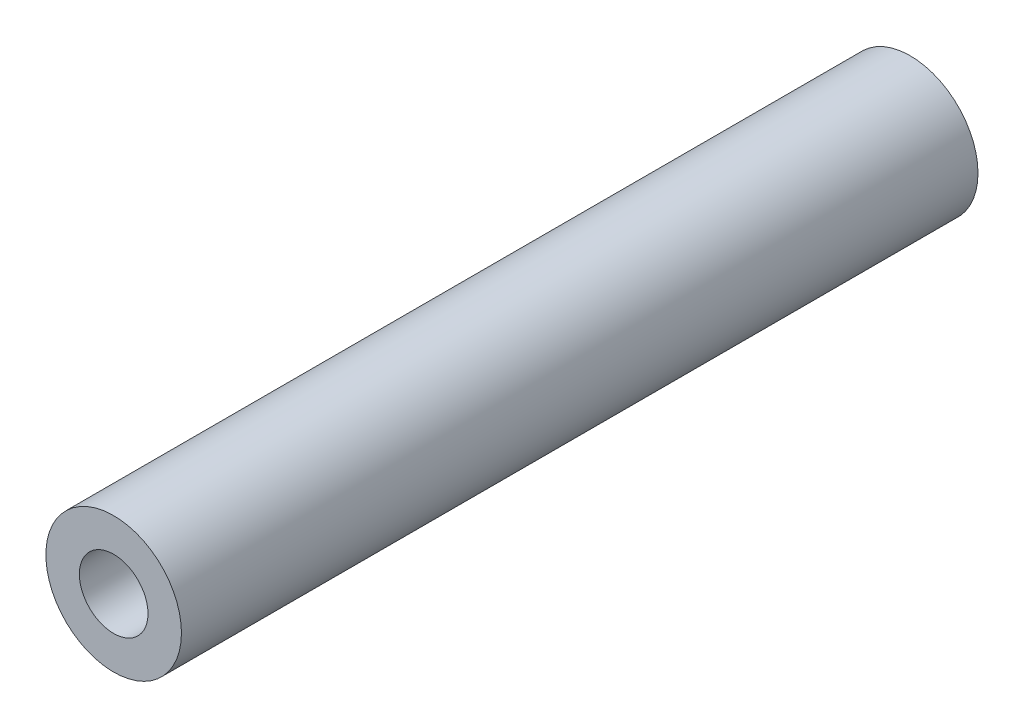
ISO-10303-21;
HEADER;
FILE_DESCRIPTION(('STEP AP214'),'2;1');
FILE_NAME('part.step','',(''),(''),'','','');
FILE_SCHEMA(('AUTOMOTIVE_DESIGN { 1 0 10303 214 1 1 1 1 }'));
ENDSEC;
DATA;
#1=APPLICATION_CONTEXT('core data for automotive mechanical design processes');
#2=APPLICATION_PROTOCOL_DEFINITION('international standard','automotive_design',2000,#1);
#3=PRODUCT_CONTEXT('',#1,'mechanical');
#4=PRODUCT('Part','Part','',(#3));
#5=PRODUCT_RELATED_PRODUCT_CATEGORY('part','',(#4));
#6=PRODUCT_DEFINITION_FORMATION('','',#4);
#7=PRODUCT_DEFINITION_CONTEXT('part definition',#1,'design');
#8=PRODUCT_DEFINITION('design','',#6,#7);
#9=PRODUCT_DEFINITION_SHAPE('','',#8);
#10=(LENGTH_UNIT() NAMED_UNIT(*) SI_UNIT(.MILLI.,.METRE.));
#11=(NAMED_UNIT(*) PLANE_ANGLE_UNIT() SI_UNIT($,.RADIAN.));
#12=(NAMED_UNIT(*) SI_UNIT($,.STERADIAN.) SOLID_ANGLE_UNIT());
#13=UNCERTAINTY_MEASURE_WITH_UNIT(LENGTH_MEASURE(1.E-05),#10,'distance_accuracy_value','');
#14=(GEOMETRIC_REPRESENTATION_CONTEXT(3) GLOBAL_UNCERTAINTY_ASSIGNED_CONTEXT((#13)) GLOBAL_UNIT_ASSIGNED_CONTEXT((#10,
#11,#12)) REPRESENTATION_CONTEXT('',''));
#15=CARTESIAN_POINT('',(0.,0.,0.));
#16=DIRECTION('',(0.,0.,1.));
#17=DIRECTION('',(1.,0.,0.));
#18=AXIS2_PLACEMENT_3D('',#15,#16,#17);
#19=CARTESIAN_POINT('',(0.,0.,94.));
#20=DIRECTION('',(0.,0.,-1.));
#21=DIRECTION('',(-1.,0.,0.));
#22=AXIS2_PLACEMENT_3D('',#19,#20,#21);
#23=CYLINDRICAL_SURFACE('',#22,8.);
#24=CARTESIAN_POINT('',(0.,0.,94.));
#25=DIRECTION('',(0.,0.,1.));
#26=DIRECTION('',(1.,0.,0.));
#27=AXIS2_PLACEMENT_3D('',#24,#25,#26);
#28=CIRCLE('',#27,8.);
#29=CARTESIAN_POINT('',(8.,0.,94.));
#30=VERTEX_POINT('',#29);
#31=EDGE_CURVE('E10',#30,#30,#28,.T.);
#32=ORIENTED_EDGE('',*,*,#31,.F.);
#33=EDGE_LOOP('',(#32));
#34=FACE_BOUND('',#33,.T.);
#35=CARTESIAN_POINT('',(0.,0.,0.));
#36=DIRECTION('',(0.,0.,1.));
#37=DIRECTION('',(1.,0.,0.));
#38=AXIS2_PLACEMENT_3D('',#35,#36,#37);
#39=CIRCLE('',#38,8.);
#40=CARTESIAN_POINT('',(8.,0.,0.));
#41=VERTEX_POINT('',#40);
#42=EDGE_CURVE('E42',#41,#41,#39,.T.);
#43=ORIENTED_EDGE('',*,*,#42,.T.);
#44=EDGE_LOOP('',(#43));
#45=FACE_BOUND('',#44,.T.);
#46=ADVANCED_FACE('F40',(#34,#45),#23,.T.);
#47=CARTESIAN_POINT('',(0.,0.,94.));
#48=DIRECTION('',(0.,0.,1.));
#49=DIRECTION('',(1.,0.,0.));
#50=AXIS2_PLACEMENT_3D('',#47,#48,#49);
#51=PLANE('',#50);
#52=CARTESIAN_POINT('',(0.,0.,94.));
#53=DIRECTION('',(0.,0.,1.));
#54=DIRECTION('',(1.,0.,0.));
#55=AXIS2_PLACEMENT_3D('',#52,#53,#54);
#56=CIRCLE('',#55,4.05);
#57=CARTESIAN_POINT('',(4.05,0.,94.));
#58=VERTEX_POINT('',#57);
#59=EDGE_CURVE('E37',#58,#58,#56,.F.);
#60=ORIENTED_EDGE('',*,*,#59,.T.);
#61=EDGE_LOOP('',(#60));
#62=FACE_BOUND('',#61,.T.);
#63=ORIENTED_EDGE('',*,*,#31,.T.);
#64=EDGE_LOOP('',(#63));
#65=FACE_BOUND('',#64,.T.);
#66=ADVANCED_FACE('F81',(#62,#65),#51,.T.);
#67=CARTESIAN_POINT('',(0.,0.,0.));
#68=DIRECTION('',(0.,0.,1.));
#69=DIRECTION('',(1.,0.,0.));
#70=AXIS2_PLACEMENT_3D('',#67,#68,#69);
#71=PLANE('',#70);
#72=CARTESIAN_POINT('',(0.,0.,0.));
#73=DIRECTION('',(0.,0.,1.));
#74=DIRECTION('',(1.,0.,0.));
#75=AXIS2_PLACEMENT_3D('',#72,#73,#74);
#76=CIRCLE('',#75,4.05);
#77=CARTESIAN_POINT('',(4.05,0.,0.));
#78=VERTEX_POINT('',#77);
#79=EDGE_CURVE('E47',#78,#78,#76,.F.);
#80=ORIENTED_EDGE('',*,*,#79,.F.);
#81=EDGE_LOOP('',(#80));
#82=FACE_BOUND('',#81,.T.);
#83=ORIENTED_EDGE('',*,*,#42,.F.);
#84=EDGE_LOOP('',(#83));
#85=FACE_BOUND('',#84,.T.);
#86=ADVANCED_FACE('F86',(#82,#85),#71,.F.);
#87=CARTESIAN_POINT('',(0.,0.,14.25));
#88=DIRECTION('',(0.,0.,-1.));
#89=DIRECTION('',(-1.,0.,0.));
#90=AXIS2_PLACEMENT_3D('',#87,#88,#89);
#91=CYLINDRICAL_SURFACE('',#90,4.05);
#92=CARTESIAN_POINT('',(0.,0.,14.25));
#93=DIRECTION('',(0.,0.,1.));
#94=DIRECTION('',(1.,0.,0.));
#95=AXIS2_PLACEMENT_3D('',#92,#93,#94);
#96=CIRCLE('',#95,4.05);
#97=CARTESIAN_POINT('',(4.05,0.,14.25));
#98=VERTEX_POINT('',#97);
#99=EDGE_CURVE('E55',#98,#98,#96,.T.);
#100=ORIENTED_EDGE('',*,*,#99,.T.);
#101=EDGE_LOOP('',(#100));
#102=FACE_BOUND('',#101,.T.);
#103=ORIENTED_EDGE('',*,*,#79,.T.);
#104=EDGE_LOOP('',(#103));
#105=FACE_BOUND('',#104,.T.);
#106=ADVANCED_FACE('F78',(#102,#105),#91,.F.);
#107=CARTESIAN_POINT('',(0.,0.,14.25));
#108=DIRECTION('',(0.,0.,1.));
#109=DIRECTION('',(1.,0.,0.));
#110=AXIS2_PLACEMENT_3D('',#107,#108,#109);
#111=PLANE('',#110);
#112=ORIENTED_EDGE('',*,*,#99,.F.);
#113=EDGE_LOOP('',(#112));
#114=FACE_BOUND('',#113,.T.);
#115=ADVANCED_FACE('F72',(#114),#111,.F.);
#116=CARTESIAN_POINT('',(0.,0.,94.1));
#117=DIRECTION('',(0.,0.,-1.));
#118=DIRECTION('',(-1.,0.,0.));
#119=AXIS2_PLACEMENT_3D('',#116,#117,#118);
#120=CYLINDRICAL_SURFACE('',#119,4.05);
#121=ORIENTED_EDGE('',*,*,#59,.F.);
#122=EDGE_LOOP('',(#121));
#123=FACE_BOUND('',#122,.T.);
#124=CARTESIAN_POINT('',(0.,0.,79.75));
#125=DIRECTION('',(0.,0.,1.));
#126=DIRECTION('',(1.,0.,0.));
#127=AXIS2_PLACEMENT_3D('',#124,#125,#126);
#128=CIRCLE('',#127,4.05);
#129=CARTESIAN_POINT('',(4.05,0.,79.75));
#130=VERTEX_POINT('',#129);
#131=EDGE_CURVE('E62',#130,#130,#128,.T.);
#132=ORIENTED_EDGE('',*,*,#131,.F.);
#133=EDGE_LOOP('',(#132));
#134=FACE_BOUND('',#133,.T.);
#135=ADVANCED_FACE('F66',(#123,#134),#120,.F.);
#136=CARTESIAN_POINT('',(0.,0.,79.75));
#137=DIRECTION('',(0.,0.,1.));
#138=DIRECTION('',(1.,0.,0.));
#139=AXIS2_PLACEMENT_3D('',#136,#137,#138);
#140=PLANE('',#139);
#141=ORIENTED_EDGE('',*,*,#131,.T.);
#142=EDGE_LOOP('',(#141));
#143=FACE_BOUND('',#142,.T.);
#144=ADVANCED_FACE('F70',(#143),#140,.T.);
#145=CLOSED_SHELL('',(#46,#66,#86,#106,#115,#135,#144));
#146=MANIFOLD_SOLID_BREP('B2',#145);
#147=ADVANCED_BREP_SHAPE_REPRESENTATION('',(#18,#146),#14);
#148=SHAPE_DEFINITION_REPRESENTATION(#9,#147);
ENDSEC;
END-ISO-10303-21;
